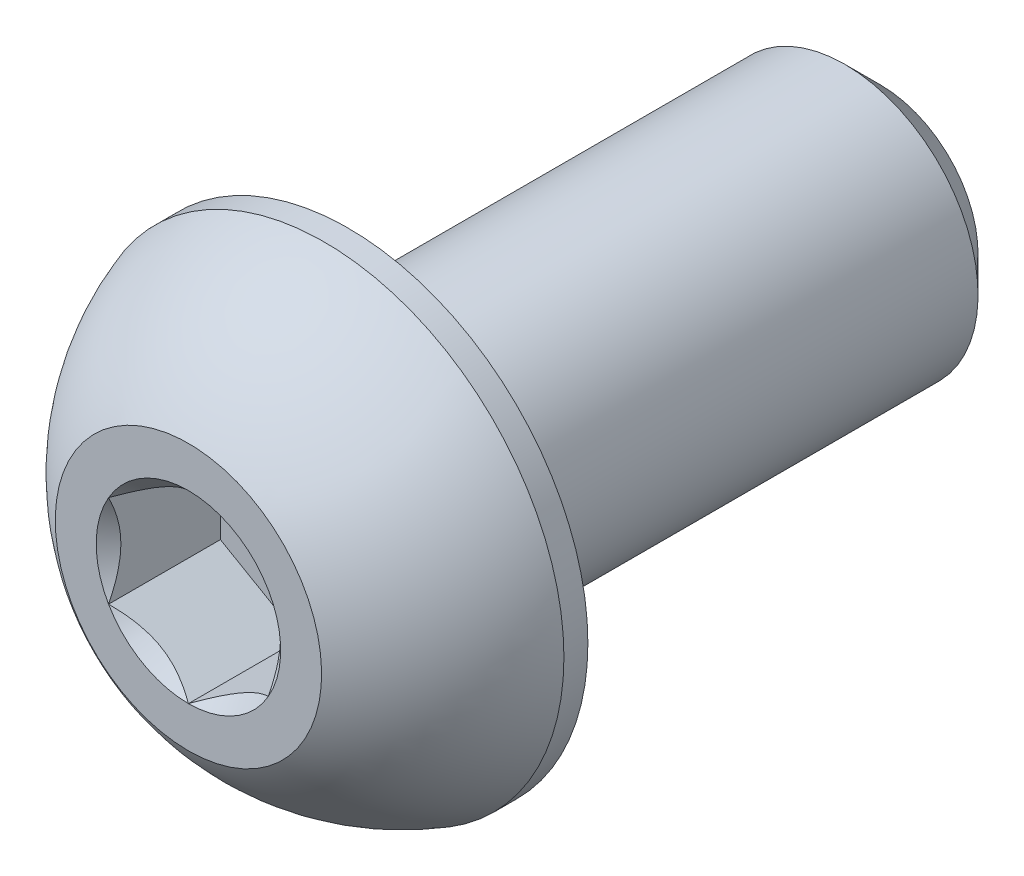
ISO-10303-21;
HEADER;
FILE_DESCRIPTION(('STEP AP214'),'2;1');
FILE_NAME('part.step','',(''),(''),'','','');
FILE_SCHEMA(('AUTOMOTIVE_DESIGN { 1 0 10303 214 1 1 1 1 }'));
ENDSEC;
DATA;
#1=APPLICATION_CONTEXT('core data for automotive mechanical design processes');
#2=APPLICATION_PROTOCOL_DEFINITION('international standard','automotive_design',2000,#1);
#3=PRODUCT_CONTEXT('',#1,'mechanical');
#4=PRODUCT('Part','Part','',(#3));
#5=PRODUCT_RELATED_PRODUCT_CATEGORY('part','',(#4));
#6=PRODUCT_DEFINITION_FORMATION('','',#4);
#7=PRODUCT_DEFINITION_CONTEXT('part definition',#1,'design');
#8=PRODUCT_DEFINITION('design','',#6,#7);
#9=PRODUCT_DEFINITION_SHAPE('','',#8);
#10=(LENGTH_UNIT() NAMED_UNIT(*) SI_UNIT(.MILLI.,.METRE.));
#11=(NAMED_UNIT(*) PLANE_ANGLE_UNIT() SI_UNIT($,.RADIAN.));
#12=(NAMED_UNIT(*) SI_UNIT($,.STERADIAN.) SOLID_ANGLE_UNIT());
#13=UNCERTAINTY_MEASURE_WITH_UNIT(LENGTH_MEASURE(1.E-05),#10,'distance_accuracy_value','');
#14=(GEOMETRIC_REPRESENTATION_CONTEXT(3) GLOBAL_UNCERTAINTY_ASSIGNED_CONTEXT((#13)) GLOBAL_UNIT_ASSIGNED_CONTEXT((#10,
#11,#12)) REPRESENTATION_CONTEXT('',''));
#15=CARTESIAN_POINT('',(0.,0.,0.));
#16=DIRECTION('',(0.,0.,1.));
#17=DIRECTION('',(1.,0.,0.));
#18=AXIS2_PLACEMENT_3D('',#15,#16,#17);
#19=CARTESIAN_POINT('',(0.,-1.25,-6.5));
#20=DIRECTION('',(0.,0.,-1.));
#21=DIRECTION('',(0.,1.,0.));
#22=AXIS2_PLACEMENT_3D('',#19,#20,#21);
#23=PLANE('',#22);
#24=CARTESIAN_POINT('',(0.,0.,-6.5));
#25=DIRECTION('',(0.,0.,-1.));
#26=DIRECTION('',(0.,1.,0.));
#27=AXIS2_PLACEMENT_3D('',#24,#25,#26);
#28=CIRCLE('',#27,0.912500000000002);
#29=CARTESIAN_POINT('',(0.,0.912500000000002,-6.5));
#30=VERTEX_POINT('',#29);
#31=EDGE_CURVE('E175',#30,#30,#28,.T.);
#32=ORIENTED_EDGE('',*,*,#31,.T.);
#33=EDGE_LOOP('',(#32));
#34=FACE_BOUND('',#33,.T.);
#35=ADVANCED_FACE('F35',(#34),#23,.T.);
#36=CARTESIAN_POINT('',(0.,0.,-6.5));
#37=DIRECTION('',(0.,0.,-1.));
#38=DIRECTION('',(0.,1.,0.));
#39=AXIS2_PLACEMENT_3D('',#36,#37,#38);
#40=CYLINDRICAL_SURFACE('',#39,1.25);
#41=CARTESIAN_POINT('',(0.,0.,-6.1625));
#42=DIRECTION('',(0.,0.,-1.));
#43=DIRECTION('',(0.,1.,0.));
#44=AXIS2_PLACEMENT_3D('',#41,#42,#43);
#45=CIRCLE('',#44,1.25);
#46=CARTESIAN_POINT('',(0.,1.25,-6.1625));
#47=VERTEX_POINT('',#46);
#48=EDGE_CURVE('E49',#47,#47,#45,.F.);
#49=ORIENTED_EDGE('',*,*,#48,.T.);
#50=EDGE_LOOP('',(#49));
#51=FACE_BOUND('',#50,.T.);
#52=CARTESIAN_POINT('',(0.,0.,-1.5));
#53=DIRECTION('',(0.,0.,1.));
#54=DIRECTION('',(1.,0.,0.));
#55=AXIS2_PLACEMENT_3D('',#52,#53,#54);
#56=CIRCLE('',#55,1.25);
#57=CARTESIAN_POINT('',(1.25,0.,-1.5));
#58=VERTEX_POINT('',#57);
#59=EDGE_CURVE('E172',#58,#58,#56,.F.);
#60=ORIENTED_EDGE('',*,*,#59,.T.);
#61=EDGE_LOOP('',(#60));
#62=FACE_BOUND('',#61,.T.);
#63=ADVANCED_FACE('F180',(#51,#62),#40,.T.);
#64=CARTESIAN_POINT('',(0.,0.,-6.5));
#65=DIRECTION('',(0.,0.,1.));
#66=DIRECTION('',(0.,-1.,0.));
#67=AXIS2_PLACEMENT_3D('',#64,#65,#66);
#68=CONICAL_SURFACE('',#67,0.912500000000002,0.785398163397446);
#69=ORIENTED_EDGE('',*,*,#48,.F.);
#70=EDGE_LOOP('',(#69));
#71=FACE_BOUND('',#70,.T.);
#72=ORIENTED_EDGE('',*,*,#31,.F.);
#73=EDGE_LOOP('',(#72));
#74=FACE_BOUND('',#73,.T.);
#75=ADVANCED_FACE('F37',(#71,#74),#68,.T.);
#76=CARTESIAN_POINT('',(0.,0.,-2.01004901960784));
#77=DIRECTION('',(0.,0.,1.));
#78=DIRECTION('',(0.,-1.,0.));
#79=AXIS2_PLACEMENT_3D('',#76,#77,#78);
#80=SPHERICAL_SURFACE('',#79,2.36702282651149);
#81=CARTESIAN_POINT('',(0.,0.,0.));
#82=DIRECTION('',(0.,0.,1.));
#83=DIRECTION('',(1.,0.,0.));
#84=AXIS2_PLACEMENT_3D('',#81,#82,#83);
#85=CIRCLE('',#84,1.25);
#86=CARTESIAN_POINT('',(0.,-1.25,0.));
#87=VERTEX_POINT('',#86);
#88=EDGE_CURVE('E169',#87,#87,#85,.T.);
#89=CARTESIAN_POINT('',(0.,0.,-1.275));
#90=DIRECTION('',(0.,0.,1.));
#91=DIRECTION('',(1.,0.,0.));
#92=AXIS2_PLACEMENT_3D('',#89,#90,#91);
#93=CIRCLE('',#92,2.25);
#94=CARTESIAN_POINT('',(0.,-2.25,-1.275));
#95=VERTEX_POINT('',#94);
#96=EDGE_CURVE('E163',#95,#95,#93,.T.);
#97=CARTESIAN_POINT('',(0.,-1.25,0.));
#98=CARTESIAN_POINT('',(0.,-1.26462917100962,-0.00909748338951261));
#99=CARTESIAN_POINT('',(0.,-1.27915898996254,-0.0183547264768161));
#100=CARTESIAN_POINT('',(0.,-1.30801307458842,-0.0371842006416701));
#101=CARTESIAN_POINT('',(0.,-1.32233734026139,-0.0467564317192207));
#102=CARTESIAN_POINT('',(0.,-1.35077346916084,-0.0662113504592343));
#103=CARTESIAN_POINT('',(0.,-1.36488533238733,-0.0760940381216974));
#104=CARTESIAN_POINT('',(0.,-1.39288993473665,-0.0961651503954438));
#105=CARTESIAN_POINT('',(0.,-1.40678267385948,-0.106353575006727));
#106=CARTESIAN_POINT('',(0.,-1.43434240376681,-0.127031306576233));
#107=CARTESIAN_POINT('',(0.,-1.44800939455129,-0.137520613534455));
#108=CARTESIAN_POINT('',(0.,-1.47511111304782,-0.15879510887493));
#109=CARTESIAN_POINT('',(0.,-1.48854584075986,-0.169580297257182));
#110=CARTESIAN_POINT('',(0.,-1.51517662859343,-0.191441414248471));
#111=CARTESIAN_POINT('',(0.,-1.52837268871496,-0.202517342857506));
#112=CARTESIAN_POINT('',(0.,-1.55451985075898,-0.224954660300191));
#113=CARTESIAN_POINT('',(0.,-1.56747095268147,-0.236316049133839));
#114=CARTESIAN_POINT('',(0.,-1.59312202445558,-0.259318870998633));
#115=CARTESIAN_POINT('',(0.,-1.60582199430721,-0.270960304029779));
#116=CARTESIAN_POINT('',(0.,-1.6309647477936,-0.294517664748896));
#117=CARTESIAN_POINT('',(0.,-1.64340753142836,-0.306433592436867));
#118=CARTESIAN_POINT('',(0.,-1.66802998093452,-0.330534262079783));
#119=CARTESIAN_POINT('',(0.,-1.68020964680593,-0.342719004034728));
#120=CARTESIAN_POINT('',(0.,-1.70430005466935,-0.367351493675378));
#121=CARTESIAN_POINT('',(0.,-1.71621079666137,-0.379799241361084));
#122=CARTESIAN_POINT('',(0.,-1.73975767884732,-0.404951808550995));
#123=CARTESIAN_POINT('',(0.,-1.75139381904126,-0.4176566280552));
#124=CARTESIAN_POINT('',(0.,-1.77438595061668,-0.443317282422173));
#125=CARTESIAN_POINT('',(0.,-1.78574194199815,-0.45627311728494));
#126=CARTESIAN_POINT('',(0.,-1.80816836248277,-0.482429626248665));
#127=CARTESIAN_POINT('',(0.,-1.81923879158591,-0.495630300349623));
#128=CARTESIAN_POINT('',(0.,-1.84108881017717,-0.52227019495309));
#129=CARTESIAN_POINT('',(0.,-1.85186839966529,-0.5357094154556));
#130=CARTESIAN_POINT('',(0.,-1.87313160033471,-0.562819996309106));
#131=CARTESIAN_POINT('',(0.,-1.88361521151601,-0.576491356660102));
#132=CARTESIAN_POINT('',(0.,-1.90428145797454,-0.604059699995121));
#133=CARTESIAN_POINT('',(0.,-1.91446409325177,-0.617956682979145));
#134=CARTESIAN_POINT('',(0.,-1.93452353378186,-0.645969646809169));
#135=CARTESIAN_POINT('',(0.,-1.94440033903471,-0.660085627655169));
#136=CARTESIAN_POINT('',(0.,-1.96384341118664,-0.68852985804056));
#137=CARTESIAN_POINT('',(0.,-1.97340967808572,-0.702858107579951));
#138=CARTESIAN_POINT('',(0.,-1.99222711323609,-0.731720044993851));
#139=CARTESIAN_POINT('',(0.,-2.00147828148738,-0.74625373286836));
#140=CARTESIAN_POINT('',(0.,-2.01966110925757,-0.775519618660566));
#141=CARTESIAN_POINT('',(0.,-2.02859276877647,-0.790251816578263));
#142=CARTESIAN_POINT('',(0.,-2.04613232130859,-0.819907699534158));
#143=CARTESIAN_POINT('',(0.,-2.0547402143218,-0.834831384572357));
#144=CARTESIAN_POINT('',(0.,-2.07162813041181,-0.864863127563144));
#145=CARTESIAN_POINT('',(0.,-2.0799081534886,-0.879971185515733));
#146=CARTESIAN_POINT('',(0.,-2.09613638256798,-0.910364472239146));
#147=CARTESIAN_POINT('',(0.,-2.10408458857057,-0.92564970100997));
#148=CARTESIAN_POINT('',(0.,-2.11964539455964,-0.956390042809473));
#149=CARTESIAN_POINT('',(0.,-2.12725799454612,-0.971845155838152));
#150=CARTESIAN_POINT('',(0.,-2.14214395948377,-1.00291789863016));
#151=CARTESIAN_POINT('',(0.,-2.14941732443493,-1.0185355283935));
#152=CARTESIAN_POINT('',(0.,-2.16362135223167,-1.04992585957694));
#153=CARTESIAN_POINT('',(0.,-2.17055201507725,-1.06569856099705));
#154=CARTESIAN_POINT('',(0.,-2.18406733408853,-1.09739151679876));
#155=CARTESIAN_POINT('',(0.,-2.19065199025422,-1.11331177118035));
#156=CARTESIAN_POINT('',(0.,-2.20347215952944,-1.1452922427279));
#157=CARTESIAN_POINT('',(0.,-2.20970767263897,-1.16135245989385));
#158=CARTESIAN_POINT('',(0.,-2.2218265737175,-1.19360520437577));
#159=CARTESIAN_POINT('',(0.,-2.2277099616865,-1.20979773169172));
#160=CARTESIAN_POINT('',(0.,-2.23912184359131,-1.2423073648535));
#161=CARTESIAN_POINT('',(0.,-2.24465033752712,-1.25862447069932));
#162=CARTESIAN_POINT('',(0.,-2.25,-1.275));
#163=B_SPLINE_CURVE_WITH_KNOTS('',3,(#97,#98,#99,#100,#101,#102,#103,#104,#105,#106,#107,#108,
#109,#110,#111,#112,#113,#114,#115,#116,#117,#118,#119,#120,#121,#122,#123,#124,#125,#126,#127,
#128,#129,#130,#131,#132,#133,#134,#135,#136,#137,#138,#139,#140,#141,#142,#143,#144,#145,#146,
#147,#148,#149,#150,#151,#152,#153,#154,#155,#156,#157,#158,#159,#160,#161,#162),.UNSPECIFIED.,
.F.,.F.,(4,2,2,2,2,2,2,2,2,2,2,2,2,2,2,2,2,2,2,2,2,2,2,2,2,2,2,2,2,2,2,2,4),(0.,
0.0516806087027544,0.103361217405509,0.155041826108264,0.206722434811019,0.258403043513773,
0.310083652216528,0.361764260919283,0.413444869622037,0.465125478324792,0.516806087027547,
0.568486695730301,0.620167304433056,0.671847913135811,0.723528521838565,0.77520913054132,
0.826889739244075,0.87857034794683,0.930250956649584,0.981931565352339,1.03361217405509,
1.08529278275785,1.1369733914606,1.18865400016336,1.24033460886611,1.29201521756887,
1.34369582627162,1.39537643497438,1.44705704367713,1.49873765237989,1.55041826108264,
1.60209886978539,1.65377947848815),.UNSPECIFIED.);
#164=EDGE_CURVE('BSEAM185',#87,#95,#163,.T.);
#165=ORIENTED_EDGE('',*,*,#88,.F.);
#166=ORIENTED_EDGE('',*,*,#96,.T.);
#167=ORIENTED_EDGE('',*,*,#164,.T.);
#168=ORIENTED_EDGE('',*,*,#164,.F.);
#169=EDGE_LOOP('',(#165,#167,#166,#168));
#170=FACE_BOUND('',#169,.T.);
#171=ADVANCED_FACE('F185',(#170),#80,.T.);
#172=CARTESIAN_POINT('',(0.,-1.25,0.));
#173=DIRECTION('',(0.,0.,-1.));
#174=DIRECTION('',(-1.,0.,0.));
#175=AXIS2_PLACEMENT_3D('',#172,#173,#174);
#176=PLANE('',#175);
#177=CARTESIAN_POINT('',(0.,0.,0.));
#178=DIRECTION('',(0.,0.,1.));
#179=DIRECTION('',(1.,0.,0.));
#180=AXIS2_PLACEMENT_3D('',#177,#178,#179);
#181=CIRCLE('',#180,0.866025403784439);
#182=CARTESIAN_POINT('',(-0.75,0.433012701892219,0.));
#183=VERTEX_POINT('',#182);
#184=CARTESIAN_POINT('',(-0.75,-0.43301270189222,0.));
#185=VERTEX_POINT('',#184);
#186=EDGE_CURVE('E62',#183,#185,#181,.T.);
#187=ORIENTED_EDGE('',*,*,#186,.F.);
#188=CARTESIAN_POINT('',(0.,0.866025403784439,0.));
#189=VERTEX_POINT('',#188);
#190=EDGE_CURVE('E134',#189,#183,#181,.T.);
#191=ORIENTED_EDGE('',*,*,#190,.F.);
#192=CARTESIAN_POINT('',(0.75,0.433012701892219,0.));
#193=VERTEX_POINT('',#192);
#194=EDGE_CURVE('E131',#193,#189,#181,.T.);
#195=ORIENTED_EDGE('',*,*,#194,.F.);
#196=CARTESIAN_POINT('',(0.75,-0.433012701892219,0.));
#197=VERTEX_POINT('',#196);
#198=EDGE_CURVE('E102',#197,#193,#181,.T.);
#199=ORIENTED_EDGE('',*,*,#198,.F.);
#200=CARTESIAN_POINT('',(0.,-0.866025403784439,0.));
#201=VERTEX_POINT('',#200);
#202=EDGE_CURVE('E94',#201,#197,#181,.T.);
#203=ORIENTED_EDGE('',*,*,#202,.F.);
#204=EDGE_CURVE('E55',#185,#201,#181,.T.);
#205=ORIENTED_EDGE('',*,*,#204,.F.);
#206=EDGE_LOOP('',(#187,#191,#195,#199,#203,#205));
#207=FACE_BOUND('',#206,.T.);
#208=ORIENTED_EDGE('',*,*,#88,.T.);
#209=EDGE_LOOP('',(#208));
#210=FACE_BOUND('',#209,.T.);
#211=ADVANCED_FACE('F128',(#207,#210),#176,.F.);
#212=CARTESIAN_POINT('',(0.,-2.25,-1.5));
#213=DIRECTION('',(0.,0.,1.));
#214=DIRECTION('',(1.,0.,0.));
#215=AXIS2_PLACEMENT_3D('',#212,#213,#214);
#216=PLANE('',#215);
#217=ORIENTED_EDGE('',*,*,#59,.F.);
#218=EDGE_LOOP('',(#217));
#219=FACE_BOUND('',#218,.T.);
#220=CARTESIAN_POINT('',(0.,0.,-1.5));
#221=DIRECTION('',(0.,0.,1.));
#222=DIRECTION('',(1.,0.,0.));
#223=AXIS2_PLACEMENT_3D('',#220,#221,#222);
#224=CIRCLE('',#223,2.25);
#225=CARTESIAN_POINT('',(2.25,0.,-1.5));
#226=VERTEX_POINT('',#225);
#227=EDGE_CURVE('E166',#226,#226,#224,.T.);
#228=ORIENTED_EDGE('',*,*,#227,.F.);
#229=EDGE_LOOP('',(#228));
#230=FACE_BOUND('',#229,.T.);
#231=ADVANCED_FACE('F199',(#219,#230),#216,.F.);
#232=CARTESIAN_POINT('',(0.,0.,0.));
#233=DIRECTION('',(0.,0.,1.));
#234=DIRECTION('',(1.,0.,0.));
#235=AXIS2_PLACEMENT_3D('',#232,#233,#234);
#236=CYLINDRICAL_SURFACE('',#235,2.25);
#237=ORIENTED_EDGE('',*,*,#96,.F.);
#238=EDGE_LOOP('',(#237));
#239=FACE_BOUND('',#238,.T.);
#240=ORIENTED_EDGE('',*,*,#227,.T.);
#241=EDGE_LOOP('',(#240));
#242=FACE_BOUND('',#241,.T.);
#243=ADVANCED_FACE('F202',(#239,#242),#236,.T.);
#244=CARTESIAN_POINT('',(0.,0.,0.));
#245=DIRECTION('',(0.,0.,1.));
#246=DIRECTION('',(1.,0.,0.));
#247=AXIS2_PLACEMENT_3D('',#244,#245,#246);
#248=CONICAL_SURFACE('',#247,0.866025403784439,0.78539816339745);
#249=ORIENTED_EDGE('',*,*,#198,.T.);
#250=CARTESIAN_POINT('',(0.75,-0.863604064848462,0.277789258135395));
#251=CARTESIAN_POINT('',(0.75,-0.842575879734332,0.26191493200841));
#252=CARTESIAN_POINT('',(0.75,-0.82143049629156,0.246196265183003));
#253=CARTESIAN_POINT('',(0.75,-0.778857857419019,0.215134520626628));
#254=CARTESIAN_POINT('',(0.75,-0.757430533042236,0.199791537493554));
#255=CARTESIAN_POINT('',(0.75,-0.692340710712936,0.154203580293666));
#256=CARTESIAN_POINT('',(0.75,-0.648190081053413,0.12464409174343));
#257=CARTESIAN_POINT('',(0.75,-0.55560718150175,0.0666155826927988));
#258=CARTESIAN_POINT('',(0.75,-0.507074363017996,0.0383051093657941));
#259=CARTESIAN_POINT('',(0.75,-0.407587529772337,-0.0134818882311099));
#260=CARTESIAN_POINT('',(0.75,-0.35664241954847,-0.0369747084681455));
#261=CARTESIAN_POINT('',(0.75,-0.28016546882077,-0.0657131004993228));
#262=CARTESIAN_POINT('',(0.75,-0.255770023930571,-0.0739607251869452));
#263=CARTESIAN_POINT('',(0.75,-0.206403277885131,-0.0885028245798084));
#264=CARTESIAN_POINT('',(0.75,-0.181431937185906,-0.0947971647308803));
#265=CARTESIAN_POINT('',(0.75,-0.106699879404924,-0.110006826119404));
#266=CARTESIAN_POINT('',(0.75,-0.056190717176217,-0.115622815287105));
#267=CARTESIAN_POINT('',(0.75,0.0430767231749065,-0.116371743545647));
#268=CARTESIAN_POINT('',(0.75,0.0918322434166286,-0.111876548594386));
#269=CARTESIAN_POINT('',(0.75,0.164112195698294,-0.098662692554016));
#270=CARTESIAN_POINT('',(0.75,0.188278676879437,-0.0930985536179214));
#271=CARTESIAN_POINT('',(0.75,0.236094480120331,-0.0800768338512741));
#272=CARTESIAN_POINT('',(0.75,0.259743845273041,-0.0726194114523399));
#273=CARTESIAN_POINT('',(0.75,0.33419827846382,-0.0463335305339124));
#274=CARTESIAN_POINT('',(0.75,0.383940060445495,-0.0245096619515552));
#275=CARTESIAN_POINT('',(0.75,0.481089225076666,0.0240118041005885));
#276=CARTESIAN_POINT('',(0.75,0.528487417973017,0.0507269113103528));
#277=CARTESIAN_POINT('',(0.75,0.619071540465251,0.105842851150781));
#278=CARTESIAN_POINT('',(0.75,0.662349745300239,0.134093945452187));
#279=CARTESIAN_POINT('',(0.75,0.726111623216225,0.177767147097504));
#280=CARTESIAN_POINT('',(0.75,0.747090419255281,0.192478860516702));
#281=CARTESIAN_POINT('',(0.75,0.78876134150186,0.222291384102401));
#282=CARTESIAN_POINT('',(0.75,0.80945354453562,0.237392086763032));
#283=CARTESIAN_POINT('',(0.75,0.830026390097469,0.252654089304728));
#284=B_SPLINE_CURVE_WITH_KNOTS('',3,(#250,#251,#252,#253,#254,#255,#256,#257,#258,#259,#260,
#261,#262,#263,#264,#265,#266,#267,#268,#269,#270,#271,#272,#273,#274,#275,#276,#277,#278,#279,
#280,#281,#282,#283),.UNSPECIFIED.,.F.,.F.,(4,2,2,2,2,2,2,2,2,2,2,2,2,2,2,2,4),(0.,
0.0790398443124679,0.158099390497593,0.317425208674101,0.485845155681377,0.653685658303957,
0.730869805636065,0.808059268704008,0.95946965338078,1.10540290447489,1.17973203111653,
1.25405493988072,1.41653726506054,1.57961304287543,1.73458511695816,1.81145152932467,
1.8882969211581),.UNSPECIFIED.);
#285=EDGE_CURVE('E11',#197,#193,#284,.T.);
#286=ORIENTED_EDGE('',*,*,#285,.F.);
#287=EDGE_LOOP('',(#249,#286));
#288=FACE_BOUND('',#287,.T.);
#289=ADVANCED_FACE('F106',(#288),#248,.F.);
#290=ORIENTED_EDGE('',*,*,#194,.T.);
#291=CARTESIAN_POINT('',(0.7502,0.432897231838381,0.000115493144769569));
#292=CARTESIAN_POINT('',(0.724410037442318,0.447787073663449,-0.0147658895360758));
#293=CARTESIAN_POINT('',(0.698188797871341,0.462925913388239,-0.0287737343930432));
#294=CARTESIAN_POINT('',(0.644720291764293,0.49379596978231,-0.0544224753177418));
#295=CARTESIAN_POINT('',(0.617467932539427,0.509530126716839,-0.0660490882943337));
#296=CARTESIAN_POINT('',(0.562514649618647,0.541257419404005,-0.0859659542277564));
#297=CARTESIAN_POINT('',(0.53482774330449,0.557242462217511,-0.0943063059186289));
#298=CARTESIAN_POINT('',(0.478844404869146,0.589564457733291,-0.107157258038574));
#299=CARTESIAN_POINT('',(0.450549685156354,0.605900421776116,-0.111677459411163));
#300=CARTESIAN_POINT('',(0.401789710731156,0.634052006136184,-0.115754166902565));
#301=CARTESIAN_POINT('',(0.381387934344427,0.645830977225008,-0.116357203385921));
#302=CARTESIAN_POINT('',(0.340623865303639,0.669366123458972,-0.115345493984474));
#303=CARTESIAN_POINT('',(0.320261582348544,0.681122293004411,-0.113730259009966));
#304=CARTESIAN_POINT('',(0.259465456913176,0.716222952390208,-0.105663853026961));
#305=CARTESIAN_POINT('',(0.2193341450039,0.73939277612396,-0.0959910641722811));
#306=CARTESIAN_POINT('',(0.148889599645974,0.7800639533493,-0.072643682027685));
#307=CARTESIAN_POINT('',(0.118246427990913,0.797755796753173,-0.0601914419277473));
#308=CARTESIAN_POINT('',(0.0581606541952098,0.83244633442859,-0.0321403897691398));
#309=CARTESIAN_POINT('',(0.028714511618409,0.849447072771901,-0.0165518140962495));
#310=CARTESIAN_POINT('',(-0.000200000000000177,0.866140873838277,0.000115493144769634));
#311=B_SPLINE_CURVE_WITH_KNOTS('',3,(#291,#292,#293,#294,#295,#296,#297,#298,#299,#300,#301,
#302,#303,#304,#305,#306,#307,#308,#309,#310),.UNSPECIFIED.,.F.,.F.,(4,2,2,2,2,2,2,2,2,4),(0.,
0.0999419466095598,0.200466857654446,0.299393763705718,0.398071297300231,0.468665775681748,
0.53927582139884,0.680536257244567,0.792918418368074,0.904939568716032),.UNSPECIFIED.);
#312=EDGE_CURVE('E133',#193,#189,#311,.T.);
#313=ORIENTED_EDGE('',*,*,#312,.F.);
#314=EDGE_LOOP('',(#290,#313));
#315=FACE_BOUND('',#314,.T.);
#316=ADVANCED_FACE('F287',(#315),#248,.F.);
#317=ORIENTED_EDGE('',*,*,#190,.T.);
#318=CARTESIAN_POINT('',(0.00019999999999979,0.866140873838277,0.000115493144769656));
#319=CARTESIAN_POINT('',(-0.0255899625576817,0.851251032013209,-0.0147658895360758));
#320=CARTESIAN_POINT('',(-0.0518112021286594,0.836112192288419,-0.0287737343930432));
#321=CARTESIAN_POINT('',(-0.105279708235707,0.805242135894348,-0.0544224753177417));
#322=CARTESIAN_POINT('',(-0.132532067460573,0.789507978959819,-0.0660490882943335));
#323=CARTESIAN_POINT('',(-0.187485350381353,0.757780686272653,-0.0859659542277563));
#324=CARTESIAN_POINT('',(-0.21517225669551,0.741795643459147,-0.0943063059186289));
#325=CARTESIAN_POINT('',(-0.271155595130854,0.709473647943367,-0.107157258038574));
#326=CARTESIAN_POINT('',(-0.299450314843646,0.693137683900542,-0.111677459411163));
#327=CARTESIAN_POINT('',(-0.348210289268844,0.664986099540474,-0.115754166902565));
#328=CARTESIAN_POINT('',(-0.368612065655573,0.653207128451649,-0.116357203385921));
#329=CARTESIAN_POINT('',(-0.409376134696361,0.629671982217686,-0.115345493984474));
#330=CARTESIAN_POINT('',(-0.429738417651456,0.617915812672247,-0.113730259009966));
#331=CARTESIAN_POINT('',(-0.490534543086824,0.58281515328645,-0.105663853026961));
#332=CARTESIAN_POINT('',(-0.5306658549961,0.559645329552697,-0.0959910641722813));
#333=CARTESIAN_POINT('',(-0.601110400354026,0.518974152327358,-0.0726436820276853));
#334=CARTESIAN_POINT('',(-0.631753572009087,0.501282308923484,-0.0601914419277475));
#335=CARTESIAN_POINT('',(-0.69183934580479,0.466591771248068,-0.03214038976914));
#336=CARTESIAN_POINT('',(-0.721285488381591,0.449591032904756,-0.0165518140962497));
#337=CARTESIAN_POINT('',(-0.7502,0.432897231838381,0.000115493144769423));
#338=B_SPLINE_CURVE_WITH_KNOTS('',3,(#318,#319,#320,#321,#322,#323,#324,#325,#326,#327,#328,
#329,#330,#331,#332,#333,#334,#335,#336,#337),.UNSPECIFIED.,.F.,.F.,(4,2,2,2,2,2,2,2,2,4),(0.,
0.0999419466095597,0.200466857654446,0.299393763705718,0.398071297300231,0.468665775681748,
0.53927582139884,0.680536257244567,0.792918418368074,0.904939568716032),.UNSPECIFIED.);
#339=EDGE_CURVE('E138',#189,#183,#338,.T.);
#340=ORIENTED_EDGE('',*,*,#339,.F.);
#341=EDGE_LOOP('',(#317,#340));
#342=FACE_BOUND('',#341,.T.);
#343=ADVANCED_FACE('F141',(#342),#248,.F.);
#344=ORIENTED_EDGE('',*,*,#186,.T.);
#345=CARTESIAN_POINT('',(-0.75,-0.863604064848463,0.277789258135397));
#346=CARTESIAN_POINT('',(-0.75,-0.842575879734334,0.261914932008411));
#347=CARTESIAN_POINT('',(-0.75,-0.821430496291561,0.246196265183004));
#348=CARTESIAN_POINT('',(-0.75,-0.77885785741902,0.215134520626629));
#349=CARTESIAN_POINT('',(-0.75,-0.757430533042237,0.199791537493554));
#350=CARTESIAN_POINT('',(-0.75,-0.692340710712936,0.154203580293667));
#351=CARTESIAN_POINT('',(-0.75,-0.648190081053414,0.12464409174343));
#352=CARTESIAN_POINT('',(-0.75,-0.55560718150175,0.0666155826927991));
#353=CARTESIAN_POINT('',(-0.75,-0.507074363017996,0.0383051093657944));
#354=CARTESIAN_POINT('',(-0.75,-0.407587529772337,-0.0134818882311097));
#355=CARTESIAN_POINT('',(-0.75,-0.356642419548471,-0.0369747084681454));
#356=CARTESIAN_POINT('',(-0.75,-0.280165468820771,-0.0657131004993228));
#357=CARTESIAN_POINT('',(-0.75,-0.255770023930572,-0.0739607251869452));
#358=CARTESIAN_POINT('',(-0.75,-0.206403277885131,-0.0885028245798085));
#359=CARTESIAN_POINT('',(-0.75,-0.181431937185907,-0.0947971647308804));
#360=CARTESIAN_POINT('',(-0.75,-0.106699879404924,-0.110006826119404));
#361=CARTESIAN_POINT('',(-0.75,-0.0561907171762172,-0.115622815287105));
#362=CARTESIAN_POINT('',(-0.75,0.0430767231749064,-0.116371743545647));
#363=CARTESIAN_POINT('',(-0.75,0.0918322434166286,-0.111876548594386));
#364=CARTESIAN_POINT('',(-0.75,0.164112195698294,-0.0986626925540161));
#365=CARTESIAN_POINT('',(-0.75,0.188278676879437,-0.0930985536179214));
#366=CARTESIAN_POINT('',(-0.75,0.236094480120331,-0.0800768338512742));
#367=CARTESIAN_POINT('',(-0.75,0.259743845273041,-0.07261941145234));
#368=CARTESIAN_POINT('',(-0.75,0.33419827846382,-0.0463335305339126));
#369=CARTESIAN_POINT('',(-0.75,0.383940060445495,-0.0245096619515553));
#370=CARTESIAN_POINT('',(-0.75,0.481089225076667,0.0240118041005886));
#371=CARTESIAN_POINT('',(-0.75,0.528487417973017,0.0507269113103528));
#372=CARTESIAN_POINT('',(-0.75,0.619071540465251,0.105842851150781));
#373=CARTESIAN_POINT('',(-0.75,0.662349745300239,0.134093945452187));
#374=CARTESIAN_POINT('',(-0.75,0.726111623216225,0.177767147097504));
#375=CARTESIAN_POINT('',(-0.75,0.747090419255281,0.192478860516702));
#376=CARTESIAN_POINT('',(-0.75,0.78876134150186,0.222291384102402));
#377=CARTESIAN_POINT('',(-0.75,0.80945354453562,0.237392086763032));
#378=CARTESIAN_POINT('',(-0.75,0.83002639009747,0.252654089304728));
#379=B_SPLINE_CURVE_WITH_KNOTS('',3,(#345,#346,#347,#348,#349,#350,#351,#352,#353,#354,#355,
#356,#357,#358,#359,#360,#361,#362,#363,#364,#365,#366,#367,#368,#369,#370,#371,#372,#373,#374,
#375,#376,#377,#378),.UNSPECIFIED.,.F.,.F.,(4,2,2,2,2,2,2,2,2,2,2,2,2,2,2,2,4),(0.,
0.0790398443124681,0.158099390497593,0.317425208674102,0.485845155681378,0.653685658303958,
0.730869805636067,0.80805926870401,0.959469653380781,1.10540290447489,1.17973203111653,
1.25405493988072,1.41653726506054,1.57961304287543,1.73458511695816,1.81145152932467,
1.88829692115811),.UNSPECIFIED.);
#380=EDGE_CURVE('E145',#183,#185,#379,.F.);
#381=ORIENTED_EDGE('',*,*,#380,.F.);
#382=EDGE_LOOP('',(#344,#381));
#383=FACE_BOUND('',#382,.T.);
#384=ADVANCED_FACE('F281',(#383),#248,.F.);
#385=ORIENTED_EDGE('',*,*,#204,.T.);
#386=CARTESIAN_POINT('',(-0.7502,-0.432897231838382,0.000115493144769569));
#387=CARTESIAN_POINT('',(-0.724410037442318,-0.447787073663449,-0.0147658895360759));
#388=CARTESIAN_POINT('',(-0.698188797871341,-0.462925913388239,-0.0287737343930432));
#389=CARTESIAN_POINT('',(-0.644720291764293,-0.49379596978231,-0.0544224753177417));
#390=CARTESIAN_POINT('',(-0.617467932539427,-0.509530126716839,-0.0660490882943335));
#391=CARTESIAN_POINT('',(-0.562514649618647,-0.541257419404005,-0.0859659542277562));
#392=CARTESIAN_POINT('',(-0.53482774330449,-0.557242462217511,-0.0943063059186287));
#393=CARTESIAN_POINT('',(-0.478844404869147,-0.589564457733291,-0.107157258038574));
#394=CARTESIAN_POINT('',(-0.450549685156355,-0.605900421776116,-0.111677459411163));
#395=CARTESIAN_POINT('',(-0.401789710731157,-0.634052006136184,-0.115754166902564));
#396=CARTESIAN_POINT('',(-0.381387934344427,-0.645830977225008,-0.116357203385921));
#397=CARTESIAN_POINT('',(-0.34062386530364,-0.669366123458972,-0.115345493984473));
#398=CARTESIAN_POINT('',(-0.320261582348545,-0.681122293004411,-0.113730259009966));
#399=CARTESIAN_POINT('',(-0.259465456913176,-0.716222952390207,-0.105663853026961));
#400=CARTESIAN_POINT('',(-0.219334145003901,-0.73939277612396,-0.095991064172281));
#401=CARTESIAN_POINT('',(-0.148889599645974,-0.7800639533493,-0.072643682027685));
#402=CARTESIAN_POINT('',(-0.118246427990913,-0.797755796753173,-0.0601914419277473));
#403=CARTESIAN_POINT('',(-0.0581606541952099,-0.83244633442859,-0.0321403897691398));
#404=CARTESIAN_POINT('',(-0.028714511618409,-0.849447072771902,-0.0165518140962494));
#405=CARTESIAN_POINT('',(0.000200000000000176,-0.866140873838277,0.000115493144769857));
#406=B_SPLINE_CURVE_WITH_KNOTS('',3,(#386,#387,#388,#389,#390,#391,#392,#393,#394,#395,#396,
#397,#398,#399,#400,#401,#402,#403,#404,#405),.UNSPECIFIED.,.F.,.F.,(4,2,2,2,2,2,2,2,2,4),(0.,
0.0999419466095598,0.200466857654446,0.299393763705717,0.39807129730023,0.468665775681748,
0.539275821398839,0.680536257244566,0.792918418368074,0.904939568716032),.UNSPECIFIED.);
#407=EDGE_CURVE('E118',#185,#201,#406,.T.);
#408=ORIENTED_EDGE('',*,*,#407,.F.);
#409=EDGE_LOOP('',(#385,#408));
#410=FACE_BOUND('',#409,.T.);
#411=ADVANCED_FACE('F229',(#410),#248,.F.);
#412=ORIENTED_EDGE('',*,*,#202,.T.);
#413=CARTESIAN_POINT('',(-0.000199999999999909,-0.866140873838277,0.000115493144769873));
#414=CARTESIAN_POINT('',(0.0255899625576817,-0.851251032013209,-0.0147658895360756));
#415=CARTESIAN_POINT('',(0.0518112021286594,-0.836112192288419,-0.028773734393043));
#416=CARTESIAN_POINT('',(0.105279708235707,-0.805242135894348,-0.0544224753177416));
#417=CARTESIAN_POINT('',(0.132532067460573,-0.789507978959819,-0.0660490882943334));
#418=CARTESIAN_POINT('',(0.187485350381353,-0.757780686272653,-0.0859659542277563));
#419=CARTESIAN_POINT('',(0.21517225669551,-0.741795643459147,-0.0943063059186288));
#420=CARTESIAN_POINT('',(0.271155595130854,-0.709473647943367,-0.107157258038574));
#421=CARTESIAN_POINT('',(0.299450314843645,-0.693137683900542,-0.111677459411163));
#422=CARTESIAN_POINT('',(0.348210289268844,-0.664986099540474,-0.115754166902564));
#423=CARTESIAN_POINT('',(0.368612065655573,-0.65320712845165,-0.116357203385921));
#424=CARTESIAN_POINT('',(0.409376134696361,-0.629671982217686,-0.115345493984473));
#425=CARTESIAN_POINT('',(0.429738417651456,-0.617915812672247,-0.113730259009966));
#426=CARTESIAN_POINT('',(0.490534543086824,-0.582815153286451,-0.105663853026961));
#427=CARTESIAN_POINT('',(0.5306658549961,-0.559645329552698,-0.0959910641722811));
#428=CARTESIAN_POINT('',(0.601110400354026,-0.518974152327358,-0.0726436820276851));
#429=CARTESIAN_POINT('',(0.631753572009087,-0.501282308923485,-0.0601914419277474));
#430=CARTESIAN_POINT('',(0.69183934580479,-0.466591771248069,-0.0321403897691399));
#431=CARTESIAN_POINT('',(0.721285488381591,-0.449591032904756,-0.0165518140962496));
#432=CARTESIAN_POINT('',(0.7502,-0.432897231838381,0.000115493144769581));
#433=B_SPLINE_CURVE_WITH_KNOTS('',3,(#413,#414,#415,#416,#417,#418,#419,#420,#421,#422,#423,
#424,#425,#426,#427,#428,#429,#430,#431,#432),.UNSPECIFIED.,.F.,.F.,(4,2,2,2,2,2,2,2,2,4),(0.,
0.0999419466095599,0.200466857654447,0.299393763705718,0.398071297300231,0.468665775681748,
0.53927582139884,0.680536257244567,0.792918418368074,0.904939568716032),.UNSPECIFIED.);
#434=EDGE_CURVE('E98',#201,#197,#433,.T.);
#435=ORIENTED_EDGE('',*,*,#434,.F.);
#436=EDGE_LOOP('',(#412,#435));
#437=FACE_BOUND('',#436,.T.);
#438=ADVANCED_FACE('F96',(#437),#248,.F.);
#439=CARTESIAN_POINT('',(0.75,-0.433012701892219,-1.05));
#440=DIRECTION('',(0.,0.,1.));
#441=DIRECTION('',(1.,0.,0.));
#442=AXIS2_PLACEMENT_3D('',#439,#440,#441);
#443=PLANE('',#442);
#444=DIRECTION('',(0.866025403784438,0.5,0.));
#445=VECTOR('',#444,1.);
#446=CARTESIAN_POINT('',(0.,-0.866025403784439,-1.05));
#447=LINE('',#446,#445);
#448=CARTESIAN_POINT('',(0.,-0.866025403784439,-1.05));
#449=VERTEX_POINT('',#448);
#450=CARTESIAN_POINT('',(0.75,-0.433012701892219,-1.05));
#451=VERTEX_POINT('',#450);
#452=EDGE_CURVE('E117',#449,#451,#447,.T.);
#453=ORIENTED_EDGE('',*,*,#452,.T.);
#454=DIRECTION('',(0.,1.,0.));
#455=VECTOR('',#454,1.);
#456=CARTESIAN_POINT('',(0.75,-0.433012701892219,-1.05));
#457=LINE('',#456,#455);
#458=CARTESIAN_POINT('',(0.75,0.433012701892219,-1.05));
#459=VERTEX_POINT('',#458);
#460=EDGE_CURVE('E122',#451,#459,#457,.T.);
#461=ORIENTED_EDGE('',*,*,#460,.T.);
#462=DIRECTION('',(-0.866025403784439,0.5,0.));
#463=VECTOR('',#462,1.);
#464=CARTESIAN_POINT('',(0.75,0.433012701892219,-1.05));
#465=LINE('',#464,#463);
#466=CARTESIAN_POINT('',(0.,0.866025403784439,-1.05));
#467=VERTEX_POINT('',#466);
#468=EDGE_CURVE('E271',#459,#467,#465,.T.);
#469=ORIENTED_EDGE('',*,*,#468,.T.);
#470=DIRECTION('',(-0.866025403784438,-0.5,0.));
#471=VECTOR('',#470,1.);
#472=CARTESIAN_POINT('',(0.,0.866025403784439,-1.05));
#473=LINE('',#472,#471);
#474=CARTESIAN_POINT('',(-0.75,0.433012701892219,-1.05));
#475=VERTEX_POINT('',#474);
#476=EDGE_CURVE('E154',#467,#475,#473,.T.);
#477=ORIENTED_EDGE('',*,*,#476,.T.);
#478=DIRECTION('',(0.,-1.,0.));
#479=VECTOR('',#478,1.);
#480=CARTESIAN_POINT('',(-0.75,0.433012701892219,-1.05));
#481=LINE('',#480,#479);
#482=CARTESIAN_POINT('',(-0.75,-0.43301270189222,-1.05));
#483=VERTEX_POINT('',#482);
#484=EDGE_CURVE('E275',#475,#483,#481,.T.);
#485=ORIENTED_EDGE('',*,*,#484,.T.);
#486=DIRECTION('',(0.866025403784439,-0.5,0.));
#487=VECTOR('',#486,1.);
#488=CARTESIAN_POINT('',(-0.75,-0.43301270189222,-1.05));
#489=LINE('',#488,#487);
#490=EDGE_CURVE('E125',#483,#449,#489,.T.);
#491=ORIENTED_EDGE('',*,*,#490,.T.);
#492=EDGE_LOOP('',(#453,#461,#469,#477,#485,#491));
#493=FACE_BOUND('',#492,.T.);
#494=ADVANCED_FACE('F228',(#493),#443,.T.);
#495=CARTESIAN_POINT('',(0.75,-0.433012701892219,-1.05));
#496=DIRECTION('',(1.,0.,0.));
#497=DIRECTION('',(0.,0.,-1.));
#498=AXIS2_PLACEMENT_3D('',#495,#496,#497);
#499=PLANE('',#498);
#500=DIRECTION('',(0.,0.,1.));
#501=VECTOR('',#500,1.);
#502=CARTESIAN_POINT('',(0.75,-0.433012701892219,-1.05));
#503=LINE('',#502,#501);
#504=EDGE_CURVE('E114',#451,#197,#503,.T.);
#505=ORIENTED_EDGE('',*,*,#504,.T.);
#506=ORIENTED_EDGE('',*,*,#285,.T.);
#507=DIRECTION('',(0.,0.,1.));
#508=VECTOR('',#507,1.);
#509=CARTESIAN_POINT('',(0.75,0.433012701892219,-1.05));
#510=LINE('',#509,#508);
#511=EDGE_CURVE('E124',#459,#193,#510,.T.);
#512=ORIENTED_EDGE('',*,*,#511,.F.);
#513=ORIENTED_EDGE('',*,*,#460,.F.);
#514=EDGE_LOOP('',(#505,#506,#512,#513));
#515=FACE_BOUND('',#514,.T.);
#516=ADVANCED_FACE('F120',(#515),#499,.F.);
#517=CARTESIAN_POINT('',(0.75,0.433012701892219,-1.05));
#518=DIRECTION('',(0.5,0.866025403784439,0.));
#519=DIRECTION('',(-0.866025403784439,0.5,0.));
#520=AXIS2_PLACEMENT_3D('',#517,#518,#519);
#521=PLANE('',#520);
#522=ORIENTED_EDGE('',*,*,#511,.T.);
#523=ORIENTED_EDGE('',*,*,#312,.T.);
#524=DIRECTION('',(0.,0.,1.));
#525=VECTOR('',#524,1.);
#526=CARTESIAN_POINT('',(0.,0.866025403784439,-1.05));
#527=LINE('',#526,#525);
#528=EDGE_CURVE('E150',#467,#189,#527,.T.);
#529=ORIENTED_EDGE('',*,*,#528,.F.);
#530=ORIENTED_EDGE('',*,*,#468,.F.);
#531=EDGE_LOOP('',(#522,#523,#529,#530));
#532=FACE_BOUND('',#531,.T.);
#533=ADVANCED_FACE('F148',(#532),#521,.F.);
#534=CARTESIAN_POINT('',(0.,0.866025403784439,-1.05));
#535=DIRECTION('',(-0.5,0.866025403784438,0.));
#536=DIRECTION('',(-0.866025403784438,-0.5,0.));
#537=AXIS2_PLACEMENT_3D('',#534,#535,#536);
#538=PLANE('',#537);
#539=ORIENTED_EDGE('',*,*,#528,.T.);
#540=ORIENTED_EDGE('',*,*,#339,.T.);
#541=DIRECTION('',(0.,0.,1.));
#542=VECTOR('',#541,1.);
#543=CARTESIAN_POINT('',(-0.75,0.433012701892219,-1.05));
#544=LINE('',#543,#542);
#545=EDGE_CURVE('E156',#475,#183,#544,.T.);
#546=ORIENTED_EDGE('',*,*,#545,.F.);
#547=ORIENTED_EDGE('',*,*,#476,.F.);
#548=EDGE_LOOP('',(#539,#540,#546,#547));
#549=FACE_BOUND('',#548,.T.);
#550=ADVANCED_FACE('F152',(#549),#538,.F.);
#551=CARTESIAN_POINT('',(-0.75,0.433012701892219,-1.05));
#552=DIRECTION('',(-1.,0.,0.));
#553=DIRECTION('',(0.,0.,1.));
#554=AXIS2_PLACEMENT_3D('',#551,#552,#553);
#555=PLANE('',#554);
#556=ORIENTED_EDGE('',*,*,#545,.T.);
#557=ORIENTED_EDGE('',*,*,#380,.T.);
#558=DIRECTION('',(0.,0.,1.));
#559=VECTOR('',#558,1.);
#560=CARTESIAN_POINT('',(-0.75,-0.43301270189222,-1.05));
#561=LINE('',#560,#559);
#562=EDGE_CURVE('E158',#483,#185,#561,.T.);
#563=ORIENTED_EDGE('',*,*,#562,.F.);
#564=ORIENTED_EDGE('',*,*,#484,.F.);
#565=EDGE_LOOP('',(#556,#557,#563,#564));
#566=FACE_BOUND('',#565,.T.);
#567=ADVANCED_FACE('F250',(#566),#555,.F.);
#568=CARTESIAN_POINT('',(-0.75,-0.43301270189222,-1.05));
#569=DIRECTION('',(-0.5,-0.866025403784439,0.));
#570=DIRECTION('',(0.866025403784439,-0.5,0.));
#571=AXIS2_PLACEMENT_3D('',#568,#569,#570);
#572=PLANE('',#571);
#573=ORIENTED_EDGE('',*,*,#562,.T.);
#574=ORIENTED_EDGE('',*,*,#407,.T.);
#575=DIRECTION('',(0.,0.,1.));
#576=VECTOR('',#575,1.);
#577=CARTESIAN_POINT('',(0.,-0.866025403784439,-1.05));
#578=LINE('',#577,#576);
#579=EDGE_CURVE('E116',#449,#201,#578,.T.);
#580=ORIENTED_EDGE('',*,*,#579,.F.);
#581=ORIENTED_EDGE('',*,*,#490,.F.);
#582=EDGE_LOOP('',(#573,#574,#580,#581));
#583=FACE_BOUND('',#582,.T.);
#584=ADVANCED_FACE('F209',(#583),#572,.F.);
#585=CARTESIAN_POINT('',(0.,-0.866025403784439,-1.05));
#586=DIRECTION('',(0.5,-0.866025403784438,0.));
#587=DIRECTION('',(0.866025403784438,0.5,0.));
#588=AXIS2_PLACEMENT_3D('',#585,#586,#587);
#589=PLANE('',#588);
#590=ORIENTED_EDGE('',*,*,#579,.T.);
#591=ORIENTED_EDGE('',*,*,#434,.T.);
#592=ORIENTED_EDGE('',*,*,#504,.F.);
#593=ORIENTED_EDGE('',*,*,#452,.F.);
#594=EDGE_LOOP('',(#590,#591,#592,#593));
#595=FACE_BOUND('',#594,.T.);
#596=ADVANCED_FACE('F112',(#595),#589,.F.);
#597=CLOSED_SHELL('',(#35,#63,#75,#171,#211,#231,#243,#289,#316,#343,#384,#411,#438,#494,#516,
#533,#550,#567,#584,#596));
#598=MANIFOLD_SOLID_BREP('B2',#597);
#599=ADVANCED_BREP_SHAPE_REPRESENTATION('',(#18,#598),#14);
#600=SHAPE_DEFINITION_REPRESENTATION(#9,#599);
ENDSEC;
END-ISO-10303-21;
